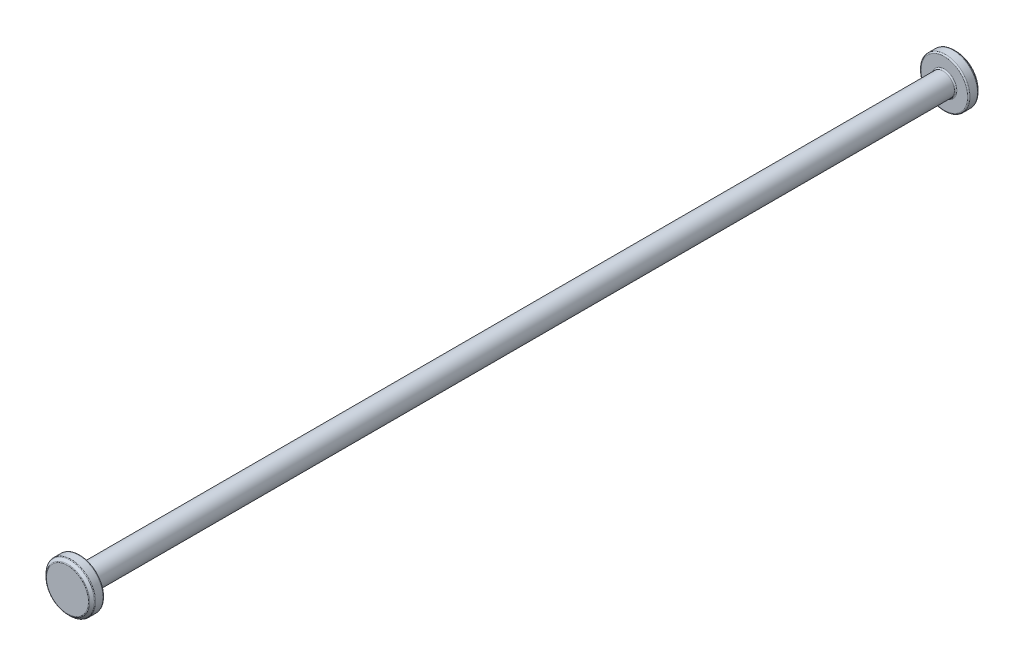
ISO-10303-21;
HEADER;
FILE_DESCRIPTION(('STEP AP214'),'2;1');
FILE_NAME('part.step','',(''),(''),'','','');
FILE_SCHEMA(('AUTOMOTIVE_DESIGN { 1 0 10303 214 1 1 1 1 }'));
ENDSEC;
DATA;
#1=APPLICATION_CONTEXT('core data for automotive mechanical design processes');
#2=APPLICATION_PROTOCOL_DEFINITION('international standard','automotive_design',2000,#1);
#3=PRODUCT_CONTEXT('',#1,'mechanical');
#4=PRODUCT('Part','Part','',(#3));
#5=PRODUCT_RELATED_PRODUCT_CATEGORY('part','',(#4));
#6=PRODUCT_DEFINITION_FORMATION('','',#4);
#7=PRODUCT_DEFINITION_CONTEXT('part definition',#1,'design');
#8=PRODUCT_DEFINITION('design','',#6,#7);
#9=PRODUCT_DEFINITION_SHAPE('','',#8);
#10=(LENGTH_UNIT() NAMED_UNIT(*) SI_UNIT(.MILLI.,.METRE.));
#11=(NAMED_UNIT(*) PLANE_ANGLE_UNIT() SI_UNIT($,.RADIAN.));
#12=(NAMED_UNIT(*) SI_UNIT($,.STERADIAN.) SOLID_ANGLE_UNIT());
#13=UNCERTAINTY_MEASURE_WITH_UNIT(LENGTH_MEASURE(1.E-05),#10,'distance_accuracy_value','');
#14=(GEOMETRIC_REPRESENTATION_CONTEXT(3) GLOBAL_UNCERTAINTY_ASSIGNED_CONTEXT((#13)) GLOBAL_UNIT_ASSIGNED_CONTEXT((#10,
#11,#12)) REPRESENTATION_CONTEXT('',''));
#15=CARTESIAN_POINT('',(0.,0.,0.));
#16=DIRECTION('',(0.,0.,1.));
#17=DIRECTION('',(1.,0.,0.));
#18=AXIS2_PLACEMENT_3D('',#15,#16,#17);
#19=CARTESIAN_POINT('',(0.,0.,35.25));
#20=DIRECTION('',(0.,0.,-1.));
#21=DIRECTION('',(-1.,0.,0.));
#22=AXIS2_PLACEMENT_3D('',#19,#20,#21);
#23=CYLINDRICAL_SURFACE('',#22,0.925);
#24=CARTESIAN_POINT('',(0.,0.,-35.15));
#25=DIRECTION('',(0.,0.,-1.));
#26=DIRECTION('',(-1.,0.,0.));
#27=AXIS2_PLACEMENT_3D('',#24,#25,#26);
#28=CIRCLE('',#27,0.925);
#29=CARTESIAN_POINT('',(-0.925,0.,-35.15));
#30=VERTEX_POINT('',#29);
#31=EDGE_CURVE('E93',#30,#30,#28,.F.);
#32=ORIENTED_EDGE('',*,*,#31,.T.);
#33=EDGE_LOOP('',(#32));
#34=FACE_BOUND('',#33,.T.);
#35=CARTESIAN_POINT('',(0.,0.,35.15));
#36=DIRECTION('',(0.,0.,1.));
#37=DIRECTION('',(1.,0.,0.));
#38=AXIS2_PLACEMENT_3D('',#35,#36,#37);
#39=CIRCLE('',#38,0.925);
#40=CARTESIAN_POINT('',(0.925,0.,35.15));
#41=VERTEX_POINT('',#40);
#42=EDGE_CURVE('E97',#41,#41,#39,.F.);
#43=ORIENTED_EDGE('',*,*,#42,.T.);
#44=EDGE_LOOP('',(#43));
#45=FACE_BOUND('',#44,.T.);
#46=ADVANCED_FACE('F45',(#34,#45),#23,.T.);
#47=CARTESIAN_POINT('',(0.,0.,36.25));
#48=DIRECTION('',(0.,0.,-1.));
#49=DIRECTION('',(-1.,0.,0.));
#50=AXIS2_PLACEMENT_3D('',#47,#48,#49);
#51=CYLINDRICAL_SURFACE('',#50,2.);
#52=CARTESIAN_POINT('',(0.,0.,35.35));
#53=DIRECTION('',(0.,0.,1.));
#54=DIRECTION('',(1.,0.,0.));
#55=AXIS2_PLACEMENT_3D('',#52,#53,#54);
#56=CIRCLE('',#55,2.);
#57=CARTESIAN_POINT('',(2.,0.,35.35));
#58=VERTEX_POINT('',#57);
#59=EDGE_CURVE('E73',#58,#58,#56,.T.);
#60=ORIENTED_EDGE('',*,*,#59,.T.);
#61=EDGE_LOOP('',(#60));
#62=FACE_BOUND('',#61,.T.);
#63=CARTESIAN_POINT('',(0.,0.,35.9585786437627));
#64=DIRECTION('',(0.,0.,1.));
#65=DIRECTION('',(1.,0.,0.));
#66=AXIS2_PLACEMENT_3D('',#63,#64,#65);
#67=CIRCLE('',#66,2.);
#68=CARTESIAN_POINT('',(2.,0.,35.9585786437627));
#69=VERTEX_POINT('',#68);
#70=EDGE_CURVE('E77',#69,#69,#67,.F.);
#71=ORIENTED_EDGE('',*,*,#70,.T.);
#72=EDGE_LOOP('',(#71));
#73=FACE_BOUND('',#72,.T.);
#74=ADVANCED_FACE('F130',(#62,#73),#51,.T.);
#75=CARTESIAN_POINT('',(0.,0.,36.25));
#76=DIRECTION('',(0.,0.,1.));
#77=DIRECTION('',(1.,0.,0.));
#78=AXIS2_PLACEMENT_3D('',#75,#76,#77);
#79=PLANE('',#78);
#80=CARTESIAN_POINT('',(0.,0.,36.25));
#81=DIRECTION('',(0.,0.,1.));
#82=DIRECTION('',(1.,0.,0.));
#83=AXIS2_PLACEMENT_3D('',#80,#81,#82);
#84=CIRCLE('',#83,1.70857864376269);
#85=CARTESIAN_POINT('',(1.70857864376269,0.,36.25));
#86=VERTEX_POINT('',#85);
#87=EDGE_CURVE('E10',#86,#86,#84,.T.);
#88=ORIENTED_EDGE('',*,*,#87,.T.);
#89=EDGE_LOOP('',(#88));
#90=FACE_BOUND('',#89,.T.);
#91=ADVANCED_FACE('F145',(#90),#79,.T.);
#92=CARTESIAN_POINT('',(0.,0.,35.25));
#93=DIRECTION('',(0.,0.,1.));
#94=DIRECTION('',(1.,0.,0.));
#95=AXIS2_PLACEMENT_3D('',#92,#93,#94);
#96=PLANE('',#95);
#97=CARTESIAN_POINT('',(0.,0.,35.25));
#98=DIRECTION('',(0.,0.,1.));
#99=DIRECTION('',(1.,0.,0.));
#100=AXIS2_PLACEMENT_3D('',#97,#98,#99);
#101=CIRCLE('',#100,1.9);
#102=CARTESIAN_POINT('',(1.9,0.,35.25));
#103=VERTEX_POINT('',#102);
#104=EDGE_CURVE('E63',#103,#103,#101,.F.);
#105=ORIENTED_EDGE('',*,*,#104,.T.);
#106=EDGE_LOOP('',(#105));
#107=FACE_BOUND('',#106,.T.);
#108=CARTESIAN_POINT('',(0.,0.,35.25));
#109=DIRECTION('',(0.,0.,1.));
#110=DIRECTION('',(1.,0.,0.));
#111=AXIS2_PLACEMENT_3D('',#108,#109,#110);
#112=CIRCLE('',#111,1.025);
#113=CARTESIAN_POINT('',(1.025,0.,35.25));
#114=VERTEX_POINT('',#113);
#115=EDGE_CURVE('E69',#114,#114,#112,.T.);
#116=ORIENTED_EDGE('',*,*,#115,.T.);
#117=EDGE_LOOP('',(#116));
#118=FACE_BOUND('',#117,.T.);
#119=ADVANCED_FACE('F142',(#107,#118),#96,.F.);
#120=CARTESIAN_POINT('',(0.,0.,36.25));
#121=DIRECTION('',(0.,0.,-1.));
#122=DIRECTION('',(-1.,0.,0.));
#123=AXIS2_PLACEMENT_3D('',#120,#121,#122);
#124=CONICAL_SURFACE('',#123,1.75,0.785398163397438);
#125=CARTESIAN_POINT('',(0.,0.,36.0292893218813));
#126=DIRECTION('',(0.,0.,-1.));
#127=DIRECTION('',(-1.,0.,0.));
#128=AXIS2_PLACEMENT_3D('',#125,#126,#127);
#129=CIRCLE('',#128,1.97071067811866);
#130=CARTESIAN_POINT('',(-1.97071067811866,0.,36.0292893218813));
#131=VERTEX_POINT('',#130);
#132=EDGE_CURVE('E53',#131,#131,#129,.F.);
#133=ORIENTED_EDGE('',*,*,#132,.T.);
#134=EDGE_LOOP('',(#133));
#135=FACE_BOUND('',#134,.T.);
#136=CARTESIAN_POINT('',(0.,0.,36.2207106781186));
#137=DIRECTION('',(0.,0.,1.));
#138=DIRECTION('',(1.,0.,0.));
#139=AXIS2_PLACEMENT_3D('',#136,#137,#138);
#140=CIRCLE('',#139,1.77928932188135);
#141=CARTESIAN_POINT('',(1.77928932188135,0.,36.2207106781186));
#142=VERTEX_POINT('',#141);
#143=EDGE_CURVE('E58',#142,#142,#140,.F.);
#144=ORIENTED_EDGE('',*,*,#143,.T.);
#145=EDGE_LOOP('',(#144));
#146=FACE_BOUND('',#145,.T.);
#147=ADVANCED_FACE('F144',(#135,#146),#124,.T.);
#148=CARTESIAN_POINT('',(0.,0.,-36.25));
#149=DIRECTION('',(0.,0.,1.));
#150=DIRECTION('',(-1.,0.,0.));
#151=AXIS2_PLACEMENT_3D('',#148,#149,#150);
#152=CYLINDRICAL_SURFACE('',#151,2.);
#153=CARTESIAN_POINT('',(0.,0.,-35.35));
#154=DIRECTION('',(0.,0.,-1.));
#155=DIRECTION('',(-1.,0.,0.));
#156=AXIS2_PLACEMENT_3D('',#153,#154,#155);
#157=CIRCLE('',#156,2.);
#158=CARTESIAN_POINT('',(-2.,0.,-35.35));
#159=VERTEX_POINT('',#158);
#160=EDGE_CURVE('E101',#159,#159,#157,.T.);
#161=ORIENTED_EDGE('',*,*,#160,.T.);
#162=EDGE_LOOP('',(#161));
#163=FACE_BOUND('',#162,.T.);
#164=CARTESIAN_POINT('',(0.,0.,-35.9585786437627));
#165=DIRECTION('',(0.,0.,1.));
#166=DIRECTION('',(1.,0.,0.));
#167=AXIS2_PLACEMENT_3D('',#164,#165,#166);
#168=CIRCLE('',#167,2.);
#169=CARTESIAN_POINT('',(2.,0.,-35.9585786437627));
#170=VERTEX_POINT('',#169);
#171=EDGE_CURVE('E105',#170,#170,#168,.T.);
#172=ORIENTED_EDGE('',*,*,#171,.T.);
#173=EDGE_LOOP('',(#172));
#174=FACE_BOUND('',#173,.T.);
#175=ADVANCED_FACE('F152',(#163,#174),#152,.T.);
#176=CARTESIAN_POINT('',(0.,0.,-36.25));
#177=DIRECTION('',(0.,0.,-1.));
#178=DIRECTION('',(1.,0.,0.));
#179=AXIS2_PLACEMENT_3D('',#176,#177,#178);
#180=PLANE('',#179);
#181=CARTESIAN_POINT('',(0.,0.,-36.25));
#182=DIRECTION('',(0.,0.,-1.));
#183=DIRECTION('',(-1.,0.,0.));
#184=AXIS2_PLACEMENT_3D('',#181,#182,#183);
#185=CIRCLE('',#184,1.70857864376269);
#186=CARTESIAN_POINT('',(-1.70857864376269,0.,-36.25));
#187=VERTEX_POINT('',#186);
#188=EDGE_CURVE('E81',#187,#187,#185,.T.);
#189=ORIENTED_EDGE('',*,*,#188,.T.);
#190=EDGE_LOOP('',(#189));
#191=FACE_BOUND('',#190,.T.);
#192=ADVANCED_FACE('F247',(#191),#180,.T.);
#193=CARTESIAN_POINT('',(0.,0.,-35.25));
#194=DIRECTION('',(0.,0.,-1.));
#195=DIRECTION('',(1.,0.,0.));
#196=AXIS2_PLACEMENT_3D('',#193,#194,#195);
#197=PLANE('',#196);
#198=CARTESIAN_POINT('',(0.,0.,-35.25));
#199=DIRECTION('',(0.,0.,-1.));
#200=DIRECTION('',(-1.,0.,0.));
#201=AXIS2_PLACEMENT_3D('',#198,#199,#200);
#202=CIRCLE('',#201,1.9);
#203=CARTESIAN_POINT('',(-1.9,0.,-35.25));
#204=VERTEX_POINT('',#203);
#205=EDGE_CURVE('E109',#204,#204,#202,.F.);
#206=ORIENTED_EDGE('',*,*,#205,.T.);
#207=EDGE_LOOP('',(#206));
#208=FACE_BOUND('',#207,.T.);
#209=CARTESIAN_POINT('',(0.,0.,-35.25));
#210=DIRECTION('',(0.,0.,-1.));
#211=DIRECTION('',(-1.,0.,0.));
#212=AXIS2_PLACEMENT_3D('',#209,#210,#211);
#213=CIRCLE('',#212,1.025);
#214=CARTESIAN_POINT('',(-1.025,0.,-35.25));
#215=VERTEX_POINT('',#214);
#216=EDGE_CURVE('E113',#215,#215,#213,.T.);
#217=ORIENTED_EDGE('',*,*,#216,.T.);
#218=EDGE_LOOP('',(#217));
#219=FACE_BOUND('',#218,.T.);
#220=ADVANCED_FACE('F118',(#208,#219),#197,.F.);
#221=CARTESIAN_POINT('',(0.,0.,-36.25));
#222=DIRECTION('',(0.,0.,1.));
#223=DIRECTION('',(-1.,0.,0.));
#224=AXIS2_PLACEMENT_3D('',#221,#222,#223);
#225=CONICAL_SURFACE('',#224,1.75,0.785398163397438);
#226=CARTESIAN_POINT('',(0.,0.,-36.2207106781186));
#227=DIRECTION('',(0.,0.,-1.));
#228=DIRECTION('',(-1.,0.,0.));
#229=AXIS2_PLACEMENT_3D('',#226,#227,#228);
#230=CIRCLE('',#229,1.77928932188135);
#231=CARTESIAN_POINT('',(-1.77928932188135,0.,-36.2207106781186));
#232=VERTEX_POINT('',#231);
#233=EDGE_CURVE('E85',#232,#232,#230,.F.);
#234=ORIENTED_EDGE('',*,*,#233,.T.);
#235=EDGE_LOOP('',(#234));
#236=FACE_BOUND('',#235,.T.);
#237=CARTESIAN_POINT('',(0.,0.,-36.0292893218813));
#238=DIRECTION('',(0.,0.,1.));
#239=DIRECTION('',(1.,0.,0.));
#240=AXIS2_PLACEMENT_3D('',#237,#238,#239);
#241=CIRCLE('',#240,1.97071067811866);
#242=CARTESIAN_POINT('',(1.97071067811866,0.,-36.0292893218813));
#243=VERTEX_POINT('',#242);
#244=EDGE_CURVE('E89',#243,#243,#241,.F.);
#245=ORIENTED_EDGE('',*,*,#244,.T.);
#246=EDGE_LOOP('',(#245));
#247=FACE_BOUND('',#246,.T.);
#248=ADVANCED_FACE('F164',(#236,#247),#225,.T.);
#249=CARTESIAN_POINT('',(0.,0.,-35.35));
#250=DIRECTION('',(0.,0.,-1.));
#251=DIRECTION('',(-1.,0.,0.));
#252=AXIS2_PLACEMENT_3D('',#249,#250,#251);
#253=TOROIDAL_SURFACE('',#252,1.9,0.1);
#254=ORIENTED_EDGE('',*,*,#160,.F.);
#255=EDGE_LOOP('',(#254));
#256=FACE_BOUND('',#255,.T.);
#257=ORIENTED_EDGE('',*,*,#205,.F.);
#258=EDGE_LOOP('',(#257));
#259=FACE_BOUND('',#258,.T.);
#260=ADVANCED_FACE('F124',(#256,#259),#253,.T.);
#261=CARTESIAN_POINT('',(0.,0.,-35.15));
#262=DIRECTION('',(0.,0.,-1.));
#263=DIRECTION('',(-1.,0.,0.));
#264=AXIS2_PLACEMENT_3D('',#261,#262,#263);
#265=TOROIDAL_SURFACE('',#264,1.025,0.1);
#266=ORIENTED_EDGE('',*,*,#216,.F.);
#267=EDGE_LOOP('',(#266));
#268=FACE_BOUND('',#267,.T.);
#269=ORIENTED_EDGE('',*,*,#31,.F.);
#270=EDGE_LOOP('',(#269));
#271=FACE_BOUND('',#270,.T.);
#272=ADVANCED_FACE('F120',(#268,#271),#265,.F.);
#273=CARTESIAN_POINT('',(0.,0.,-36.15));
#274=DIRECTION('',(0.,0.,-1.));
#275=DIRECTION('',(-1.,0.,0.));
#276=AXIS2_PLACEMENT_3D('',#273,#274,#275);
#277=TOROIDAL_SURFACE('',#276,1.70857864376269,0.1);
#278=ORIENTED_EDGE('',*,*,#188,.F.);
#279=EDGE_LOOP('',(#278));
#280=FACE_BOUND('',#279,.T.);
#281=ORIENTED_EDGE('',*,*,#233,.F.);
#282=EDGE_LOOP('',(#281));
#283=FACE_BOUND('',#282,.T.);
#284=ADVANCED_FACE('F123',(#280,#283),#277,.T.);
#285=CARTESIAN_POINT('',(0.,0.,-35.9585786437627));
#286=DIRECTION('',(0.,0.,1.));
#287=DIRECTION('',(1.,0.,0.));
#288=AXIS2_PLACEMENT_3D('',#285,#286,#287);
#289=TOROIDAL_SURFACE('',#288,1.9,0.1);
#290=ORIENTED_EDGE('',*,*,#171,.F.);
#291=EDGE_LOOP('',(#290));
#292=FACE_BOUND('',#291,.T.);
#293=ORIENTED_EDGE('',*,*,#244,.F.);
#294=EDGE_LOOP('',(#293));
#295=FACE_BOUND('',#294,.T.);
#296=ADVANCED_FACE('F169',(#292,#295),#289,.T.);
#297=CARTESIAN_POINT('',(0.,0.,35.35));
#298=DIRECTION('',(0.,0.,1.));
#299=DIRECTION('',(1.,0.,0.));
#300=AXIS2_PLACEMENT_3D('',#297,#298,#299);
#301=TOROIDAL_SURFACE('',#300,1.9,0.1);
#302=ORIENTED_EDGE('',*,*,#104,.F.);
#303=EDGE_LOOP('',(#302));
#304=FACE_BOUND('',#303,.T.);
#305=ORIENTED_EDGE('',*,*,#59,.F.);
#306=EDGE_LOOP('',(#305));
#307=FACE_BOUND('',#306,.T.);
#308=ADVANCED_FACE('F138',(#304,#307),#301,.T.);
#309=CARTESIAN_POINT('',(0.,0.,35.15));
#310=DIRECTION('',(0.,0.,1.));
#311=DIRECTION('',(1.,0.,0.));
#312=AXIS2_PLACEMENT_3D('',#309,#310,#311);
#313=TOROIDAL_SURFACE('',#312,1.025,0.1);
#314=ORIENTED_EDGE('',*,*,#42,.F.);
#315=EDGE_LOOP('',(#314));
#316=FACE_BOUND('',#315,.T.);
#317=ORIENTED_EDGE('',*,*,#115,.F.);
#318=EDGE_LOOP('',(#317));
#319=FACE_BOUND('',#318,.T.);
#320=ADVANCED_FACE('F134',(#316,#319),#313,.F.);
#321=CARTESIAN_POINT('',(0.,0.,35.9585786437627));
#322=DIRECTION('',(0.,0.,1.));
#323=DIRECTION('',(1.,0.,0.));
#324=AXIS2_PLACEMENT_3D('',#321,#322,#323);
#325=TOROIDAL_SURFACE('',#324,1.9,0.1);
#326=ORIENTED_EDGE('',*,*,#132,.F.);
#327=EDGE_LOOP('',(#326));
#328=FACE_BOUND('',#327,.T.);
#329=ORIENTED_EDGE('',*,*,#70,.F.);
#330=EDGE_LOOP('',(#329));
#331=FACE_BOUND('',#330,.T.);
#332=ADVANCED_FACE('F137',(#328,#331),#325,.T.);
#333=CARTESIAN_POINT('',(0.,0.,36.15));
#334=DIRECTION('',(0.,0.,1.));
#335=DIRECTION('',(1.,0.,0.));
#336=AXIS2_PLACEMENT_3D('',#333,#334,#335);
#337=TOROIDAL_SURFACE('',#336,1.70857864376269,0.1);
#338=ORIENTED_EDGE('',*,*,#143,.F.);
#339=EDGE_LOOP('',(#338));
#340=FACE_BOUND('',#339,.T.);
#341=ORIENTED_EDGE('',*,*,#87,.F.);
#342=EDGE_LOOP('',(#341));
#343=FACE_BOUND('',#342,.T.);
#344=ADVANCED_FACE('F47',(#340,#343),#337,.T.);
#345=CLOSED_SHELL('',(#46,#74,#91,#119,#147,#175,#192,#220,#248,#260,#272,#284,#296,#308,#320,
#332,#344));
#346=MANIFOLD_SOLID_BREP('B2',#345);
#347=ADVANCED_BREP_SHAPE_REPRESENTATION('',(#18,#346),#14);
#348=SHAPE_DEFINITION_REPRESENTATION(#9,#347);
ENDSEC;
END-ISO-10303-21;
